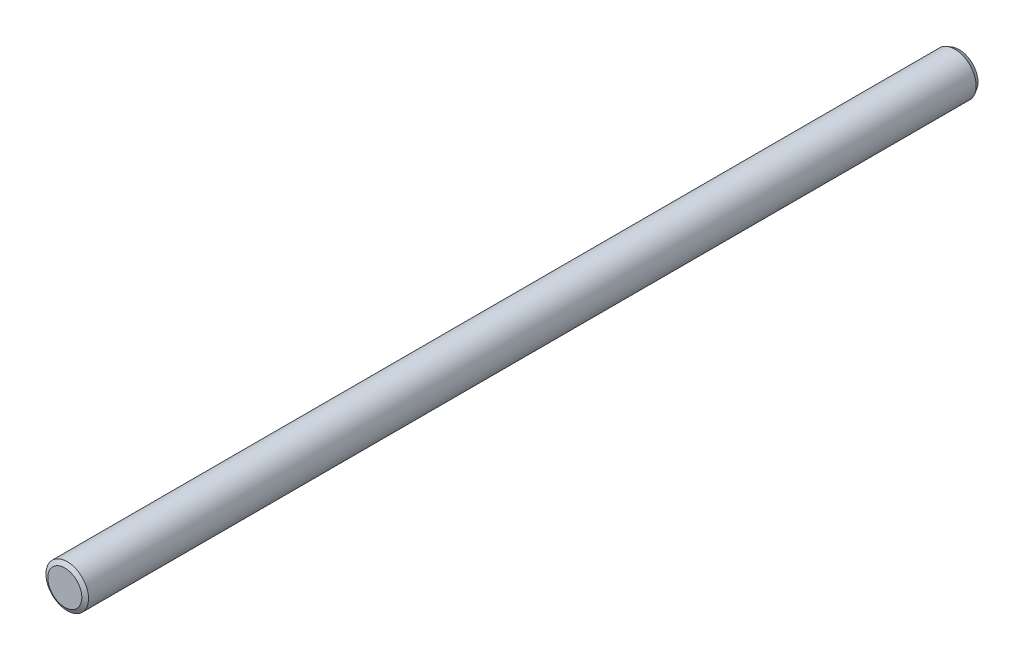
ISO-10303-21;
HEADER;
FILE_DESCRIPTION(('STEP AP214'),'2;1');
FILE_NAME('part.step','',(''),(''),'','','');
FILE_SCHEMA(('AUTOMOTIVE_DESIGN { 1 0 10303 214 1 1 1 1 }'));
ENDSEC;
DATA;
#1=APPLICATION_CONTEXT('core data for automotive mechanical design processes');
#2=APPLICATION_PROTOCOL_DEFINITION('international standard','automotive_design',2000,#1);
#3=PRODUCT_CONTEXT('',#1,'mechanical');
#4=PRODUCT('Part','Part','',(#3));
#5=PRODUCT_RELATED_PRODUCT_CATEGORY('part','',(#4));
#6=PRODUCT_DEFINITION_FORMATION('','',#4);
#7=PRODUCT_DEFINITION_CONTEXT('part definition',#1,'design');
#8=PRODUCT_DEFINITION('design','',#6,#7);
#9=PRODUCT_DEFINITION_SHAPE('','',#8);
#10=(LENGTH_UNIT() NAMED_UNIT(*) SI_UNIT(.MILLI.,.METRE.));
#11=(NAMED_UNIT(*) PLANE_ANGLE_UNIT() SI_UNIT($,.RADIAN.));
#12=(NAMED_UNIT(*) SI_UNIT($,.STERADIAN.) SOLID_ANGLE_UNIT());
#13=UNCERTAINTY_MEASURE_WITH_UNIT(LENGTH_MEASURE(1.E-05),#10,'distance_accuracy_value','');
#14=(GEOMETRIC_REPRESENTATION_CONTEXT(3) GLOBAL_UNCERTAINTY_ASSIGNED_CONTEXT((#13)) GLOBAL_UNIT_ASSIGNED_CONTEXT((#10,
#11,#12)) REPRESENTATION_CONTEXT('',''));
#15=CARTESIAN_POINT('',(0.,0.,0.));
#16=DIRECTION('',(0.,0.,1.));
#17=DIRECTION('',(1.,0.,0.));
#18=AXIS2_PLACEMENT_3D('',#15,#16,#17);
#19=CARTESIAN_POINT('',(0.,0.,105.));
#20=DIRECTION('',(0.,0.,-1.));
#21=DIRECTION('',(-1.,0.,0.));
#22=AXIS2_PLACEMENT_3D('',#19,#20,#21);
#23=CYLINDRICAL_SURFACE('',#22,2.5);
#24=CARTESIAN_POINT('',(0.,0.,104.711324865405));
#25=DIRECTION('',(0.,0.,1.));
#26=DIRECTION('',(1.,0.,0.));
#27=AXIS2_PLACEMENT_3D('',#24,#25,#26);
#28=CIRCLE('',#27,2.5);
#29=CARTESIAN_POINT('',(2.5,0.,104.711324865405));
#30=VERTEX_POINT('',#29);
#31=EDGE_CURVE('E45',#30,#30,#28,.F.);
#32=ORIENTED_EDGE('',*,*,#31,.T.);
#33=EDGE_LOOP('',(#32));
#34=FACE_BOUND('',#33,.T.);
#35=CARTESIAN_POINT('',(0.,0.,0.500000000000014));
#36=DIRECTION('',(0.,0.,1.));
#37=DIRECTION('',(1.,0.,0.));
#38=AXIS2_PLACEMENT_3D('',#35,#36,#37);
#39=CIRCLE('',#38,2.5);
#40=CARTESIAN_POINT('',(2.5,0.,0.500000000000014));
#41=VERTEX_POINT('',#40);
#42=EDGE_CURVE('E50',#41,#41,#39,.T.);
#43=ORIENTED_EDGE('',*,*,#42,.T.);
#44=EDGE_LOOP('',(#43));
#45=FACE_BOUND('',#44,.T.);
#46=ADVANCED_FACE('F37',(#34,#45),#23,.T.);
#47=CARTESIAN_POINT('',(0.,0.,105.));
#48=DIRECTION('',(0.,0.,1.));
#49=DIRECTION('',(1.,0.,0.));
#50=AXIS2_PLACEMENT_3D('',#47,#48,#49);
#51=PLANE('',#50);
#52=CARTESIAN_POINT('',(0.,0.,105.));
#53=DIRECTION('',(0.,0.,1.));
#54=DIRECTION('',(1.,0.,0.));
#55=AXIS2_PLACEMENT_3D('',#52,#53,#54);
#56=CIRCLE('',#55,2.00000000000003);
#57=CARTESIAN_POINT('',(2.00000000000003,0.,105.));
#58=VERTEX_POINT('',#57);
#59=EDGE_CURVE('E55',#58,#58,#56,.T.);
#60=ORIENTED_EDGE('',*,*,#59,.T.);
#61=EDGE_LOOP('',(#60));
#62=FACE_BOUND('',#61,.T.);
#63=ADVANCED_FACE('F62',(#62),#51,.T.);
#64=CARTESIAN_POINT('',(0.,0.,0.));
#65=DIRECTION('',(0.,0.,1.));
#66=DIRECTION('',(1.,0.,0.));
#67=AXIS2_PLACEMENT_3D('',#64,#65,#66);
#68=PLANE('',#67);
#69=CARTESIAN_POINT('',(0.,0.,0.));
#70=DIRECTION('',(0.,0.,1.));
#71=DIRECTION('',(1.,0.,0.));
#72=AXIS2_PLACEMENT_3D('',#69,#70,#71);
#73=CIRCLE('',#72,2.21132486540517);
#74=CARTESIAN_POINT('',(2.21132486540517,0.,0.));
#75=VERTEX_POINT('',#74);
#76=EDGE_CURVE('E10',#75,#75,#73,.F.);
#77=ORIENTED_EDGE('',*,*,#76,.T.);
#78=EDGE_LOOP('',(#77));
#79=FACE_BOUND('',#78,.T.);
#80=ADVANCED_FACE('F66',(#79),#68,.F.);
#81=CARTESIAN_POINT('',(0.,0.,105.));
#82=DIRECTION('',(0.,0.,-1.));
#83=DIRECTION('',(-1.,0.,0.));
#84=AXIS2_PLACEMENT_3D('',#81,#82,#83);
#85=CONICAL_SURFACE('',#84,2.00000000000003,1.0471975511966);
#86=ORIENTED_EDGE('',*,*,#31,.F.);
#87=EDGE_LOOP('',(#86));
#88=FACE_BOUND('',#87,.T.);
#89=ORIENTED_EDGE('',*,*,#59,.F.);
#90=EDGE_LOOP('',(#89));
#91=FACE_BOUND('',#90,.T.);
#92=ADVANCED_FACE('F64',(#88,#91),#85,.T.);
#93=CARTESIAN_POINT('',(0.,0.,0.500000000000014));
#94=DIRECTION('',(0.,0.,1.));
#95=DIRECTION('',(1.,0.,0.));
#96=AXIS2_PLACEMENT_3D('',#93,#94,#95);
#97=CONICAL_SURFACE('',#96,2.5,0.52359877559831);
#98=ORIENTED_EDGE('',*,*,#76,.F.);
#99=EDGE_LOOP('',(#98));
#100=FACE_BOUND('',#99,.T.);
#101=ORIENTED_EDGE('',*,*,#42,.F.);
#102=EDGE_LOOP('',(#101));
#103=FACE_BOUND('',#102,.T.);
#104=ADVANCED_FACE('F39',(#100,#103),#97,.T.);
#105=CLOSED_SHELL('',(#46,#63,#80,#92,#104));
#106=MANIFOLD_SOLID_BREP('B2',#105);
#107=ADVANCED_BREP_SHAPE_REPRESENTATION('',(#18,#106),#14);
#108=SHAPE_DEFINITION_REPRESENTATION(#9,#107);
ENDSEC;
END-ISO-10303-21;
